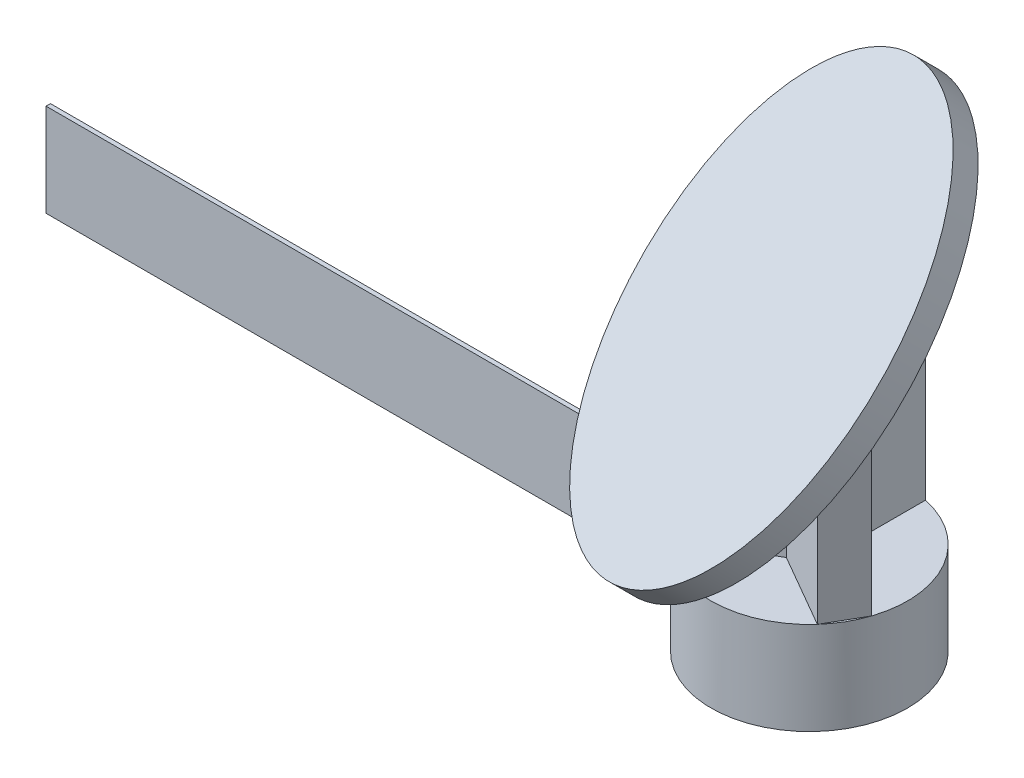
ISO-10303-21;
HEADER;
FILE_DESCRIPTION(('STEP AP214'),'2;1');
FILE_NAME('part.step','',(''),(''),'','','');
FILE_SCHEMA(('AUTOMOTIVE_DESIGN { 1 0 10303 214 1 1 1 1 }'));
ENDSEC;
DATA;
#1=APPLICATION_CONTEXT('core data for automotive mechanical design processes');
#2=APPLICATION_PROTOCOL_DEFINITION('international standard','automotive_design',2000,#1);
#3=PRODUCT_CONTEXT('',#1,'mechanical');
#4=PRODUCT('Part','Part','',(#3));
#5=PRODUCT_RELATED_PRODUCT_CATEGORY('part','',(#4));
#6=PRODUCT_DEFINITION_FORMATION('','',#4);
#7=PRODUCT_DEFINITION_CONTEXT('part definition',#1,'design');
#8=PRODUCT_DEFINITION('design','',#6,#7);
#9=PRODUCT_DEFINITION_SHAPE('','',#8);
#10=(LENGTH_UNIT() NAMED_UNIT(*) SI_UNIT(.MILLI.,.METRE.));
#11=(NAMED_UNIT(*) PLANE_ANGLE_UNIT() SI_UNIT($,.RADIAN.));
#12=(NAMED_UNIT(*) SI_UNIT($,.STERADIAN.) SOLID_ANGLE_UNIT());
#13=UNCERTAINTY_MEASURE_WITH_UNIT(LENGTH_MEASURE(1.E-05),#10,'distance_accuracy_value','');
#14=(GEOMETRIC_REPRESENTATION_CONTEXT(3) GLOBAL_UNCERTAINTY_ASSIGNED_CONTEXT((#13)) GLOBAL_UNIT_ASSIGNED_CONTEXT((#10,
#11,#12)) REPRESENTATION_CONTEXT('',''));
#15=CARTESIAN_POINT('',(0.,0.,0.));
#16=DIRECTION('',(0.,0.,1.));
#17=DIRECTION('',(1.,0.,0.));
#18=AXIS2_PLACEMENT_3D('',#15,#16,#17);
#19=CARTESIAN_POINT('',(0.,21.,0.));
#20=DIRECTION('',(0.,-1.,0.));
#21=DIRECTION('',(0.,0.,-1.));
#22=AXIS2_PLACEMENT_3D('',#19,#20,#21);
#23=CYLINDRICAL_SURFACE('',#22,22.225);
#24=CARTESIAN_POINT('',(-22.225,0.,0.5));
#25=DIRECTION('',(0.,1.,0.));
#26=VECTOR('',#25,1.);
#27=LINE('',#24,#26);
#28=CARTESIAN_POINT('',(-22.2221565787341,0.,0.499968121450206));
#29=VERTEX_POINT('',#28);
#30=CARTESIAN_POINT('',(-22.2221564125486,21.,0.499968805694616));
#31=VERTEX_POINT('',#30);
#32=EDGE_CURVE('E105',#29,#31,#27,.T.);
#33=ORIENTED_EDGE('',*,*,#32,.F.);
#34=CARTESIAN_POINT('',(0.,0.,0.));
#35=DIRECTION('',(0.,-1.,0.));
#36=DIRECTION('',(0.,0.,-1.));
#37=AXIS2_PLACEMENT_3D('',#34,#35,#36);
#38=CIRCLE('',#37,22.225);
#39=CARTESIAN_POINT('',(-22.222156577973,0.,-0.499968166586654));
#40=VERTEX_POINT('',#39);
#41=EDGE_CURVE('E106',#29,#40,#38,.F.);
#42=ORIENTED_EDGE('',*,*,#41,.T.);
#43=CARTESIAN_POINT('',(-22.225,21.,-0.5));
#44=DIRECTION('',(0.,-1.,0.));
#45=VECTOR('',#44,1.);
#46=LINE('',#43,#45);
#47=CARTESIAN_POINT('',(-22.222156395549,21.,-0.499968767093905));
#48=VERTEX_POINT('',#47);
#49=EDGE_CURVE('E115',#48,#40,#46,.T.);
#50=ORIENTED_EDGE('',*,*,#49,.F.);
#51=CARTESIAN_POINT('',(0.,21.,0.));
#52=DIRECTION('',(0.,-1.,0.));
#53=DIRECTION('',(0.,0.,-1.));
#54=AXIS2_PLACEMENT_3D('',#51,#52,#53);
#55=CIRCLE('',#54,22.225);
#56=CARTESIAN_POINT('',(-4.50000000000001,21.,-21.7646645965427));
#57=VERTEX_POINT('',#56);
#58=EDGE_CURVE('E267',#57,#48,#55,.F.);
#59=ORIENTED_EDGE('',*,*,#58,.F.);
#60=CARTESIAN_POINT('',(0.,21.,0.));
#61=DIRECTION('',(0.,1.,0.));
#62=DIRECTION('',(0.,0.,1.));
#63=AXIS2_PLACEMENT_3D('',#60,#61,#62);
#64=CIRCLE('',#63,22.225);
#65=CARTESIAN_POINT('',(4.5,21.,-21.7646645965427));
#66=VERTEX_POINT('',#65);
#67=EDGE_CURVE('E280',#66,#57,#64,.T.);
#68=ORIENTED_EDGE('',*,*,#67,.F.);
#69=CARTESIAN_POINT('',(21.0987524454537,21.,6.98521798124149));
#70=VERTEX_POINT('',#69);
#71=EDGE_CURVE('E51',#70,#66,#64,.T.);
#72=ORIENTED_EDGE('',*,*,#71,.F.);
#73=CARTESIAN_POINT('',(16.5987524454537,21.,14.7794466153014));
#74=VERTEX_POINT('',#73);
#75=EDGE_CURVE('E11',#74,#70,#64,.T.);
#76=ORIENTED_EDGE('',*,*,#75,.F.);
#77=CARTESIAN_POINT('',(-16.5987524454539,21.,14.7794466153012));
#78=VERTEX_POINT('',#77);
#79=EDGE_CURVE('E125',#78,#74,#64,.T.);
#80=ORIENTED_EDGE('',*,*,#79,.F.);
#81=CARTESIAN_POINT('',(-21.0987524454538,21.,6.98521798124118));
#82=VERTEX_POINT('',#81);
#83=EDGE_CURVE('E52',#82,#78,#64,.T.);
#84=ORIENTED_EDGE('',*,*,#83,.F.);
#85=CARTESIAN_POINT('',(0.,21.,0.));
#86=DIRECTION('',(0.,-1.,0.));
#87=DIRECTION('',(0.,0.,-1.));
#88=AXIS2_PLACEMENT_3D('',#85,#86,#87);
#89=CIRCLE('',#88,22.225);
#90=EDGE_CURVE('E61',#31,#82,#89,.F.);
#91=ORIENTED_EDGE('',*,*,#90,.F.);
#92=EDGE_LOOP('',(#33,#42,#50,#59,#68,#72,#76,#80,#84,#91));
#93=FACE_BOUND('',#92,.T.);
#94=ADVANCED_FACE('F41',(#93),#23,.T.);
#95=CARTESIAN_POINT('',(2.24999999999996,92.,3.89711431702999));
#96=DIRECTION('',(-0.499999999999992,0.,-0.866025403784443));
#97=DIRECTION('',(-0.866025403784443,0.,0.499999999999992));
#98=AXIS2_PLACEMENT_3D('',#95,#96,#97);
#99=PLANE('',#98);
#100=DIRECTION('',(0.774596669241491,0.447213595499951,-0.447213595499952));
#101=VECTOR('',#100,1.);
#102=CARTESIAN_POINT('',(11.1395009781814,71.4705768691418,-1.23524146568438));
#103=LINE('',#102,#101);
#104=CARTESIAN_POINT('',(-16.5987524454539,55.4558887881563,14.7794466153012));
#105=VERTEX_POINT('',#104);
#106=CARTESIAN_POINT('',(0.,65.0391829807508,5.19615242270662));
#107=VERTEX_POINT('',#106);
#108=EDGE_CURVE('E193',#105,#107,#103,.T.);
#109=ORIENTED_EDGE('',*,*,#108,.F.);
#110=DIRECTION('',(0.,-1.,0.));
#111=VECTOR('',#110,1.);
#112=CARTESIAN_POINT('',(-16.5987524454539,92.,14.7794466153012));
#113=LINE('',#112,#111);
#114=EDGE_CURVE('E213',#105,#78,#113,.T.);
#115=ORIENTED_EDGE('',*,*,#114,.T.);
#116=DIRECTION('',(0.866025403784443,0.,-0.499999999999992));
#117=VECTOR('',#116,1.);
#118=CARTESIAN_POINT('',(2.24999999999996,21.,3.89711431702999));
#119=LINE('',#118,#117);
#120=CARTESIAN_POINT('',(0.,21.,5.19615242270662));
#121=VERTEX_POINT('',#120);
#122=EDGE_CURVE('E207',#78,#121,#119,.T.);
#123=ORIENTED_EDGE('',*,*,#122,.T.);
#124=DIRECTION('',(0.,-1.,0.));
#125=VECTOR('',#124,1.);
#126=CARTESIAN_POINT('',(0.,92.,5.19615242270662));
#127=LINE('',#126,#125);
#128=EDGE_CURVE('E243',#107,#121,#127,.T.);
#129=ORIENTED_EDGE('',*,*,#128,.F.);
#130=EDGE_LOOP('',(#109,#115,#123,#129));
#131=FACE_BOUND('',#130,.T.);
#132=ADVANCED_FACE('F370',(#131),#99,.F.);
#133=CARTESIAN_POINT('',(-2.25000000000002,92.,3.89711431702996));
#134=DIRECTION('',(0.500000000000004,0.,-0.866025403784436));
#135=DIRECTION('',(-0.866025403784436,0.,-0.500000000000004));
#136=AXIS2_PLACEMENT_3D('',#133,#134,#135);
#137=PLANE('',#136);
#138=DIRECTION('',(0.774596669241481,-0.44721359549996,0.447213595499961));
#139=VECTOR('',#138,1.);
#140=CARTESIAN_POINT('',(-11.1395009781815,71.470576869142,-1.2352414656846));
#141=LINE('',#140,#139);
#142=CARTESIAN_POINT('',(16.5987524454537,55.455888788156,14.7794466153014));
#143=VERTEX_POINT('',#142);
#144=EDGE_CURVE('E197',#107,#143,#141,.T.);
#145=ORIENTED_EDGE('',*,*,#144,.F.);
#146=ORIENTED_EDGE('',*,*,#128,.T.);
#147=DIRECTION('',(0.866025403784436,0.,0.500000000000004));
#148=VECTOR('',#147,1.);
#149=CARTESIAN_POINT('',(-2.25000000000002,21.,3.89711431702996));
#150=LINE('',#149,#148);
#151=EDGE_CURVE('E220',#121,#74,#150,.T.);
#152=ORIENTED_EDGE('',*,*,#151,.T.);
#153=DIRECTION('',(0.,-1.,0.));
#154=VECTOR('',#153,1.);
#155=CARTESIAN_POINT('',(16.5987524454537,92.,14.7794466153014));
#156=LINE('',#155,#154);
#157=EDGE_CURVE('E241',#143,#74,#156,.T.);
#158=ORIENTED_EDGE('',*,*,#157,.F.);
#159=EDGE_LOOP('',(#145,#146,#152,#158));
#160=FACE_BOUND('',#159,.T.);
#161=ADVANCED_FACE('F358',(#160),#137,.F.);
#162=CARTESIAN_POINT('',(18.8487524454537,92.,10.8823322982714));
#163=DIRECTION('',(-0.866025403784436,0.,-0.500000000000004));
#164=DIRECTION('',(-0.500000000000004,0.,0.866025403784436));
#165=AXIS2_PLACEMENT_3D('',#162,#163,#164);
#166=PLANE('',#165);
#167=DIRECTION('',(0.377964473009231,0.654653670707975,-0.654653670707977));
#168=VECTOR('',#167,1.);
#169=CARTESIAN_POINT('',(26.9267892077911,73.3445732029633,-3.10923779950594));
#170=LINE('',#169,#168);
#171=CARTESIAN_POINT('',(21.0987524454538,63.250117422216,6.98521798124148));
#172=VERTEX_POINT('',#171);
#173=EDGE_CURVE('E199',#143,#172,#170,.T.);
#174=ORIENTED_EDGE('',*,*,#173,.F.);
#175=ORIENTED_EDGE('',*,*,#157,.T.);
#176=DIRECTION('',(0.500000000000004,0.,-0.866025403784436));
#177=VECTOR('',#176,1.);
#178=CARTESIAN_POINT('',(18.8487524454537,21.,10.8823322982714));
#179=LINE('',#178,#177);
#180=EDGE_CURVE('E219',#74,#70,#179,.T.);
#181=ORIENTED_EDGE('',*,*,#180,.T.);
#182=DIRECTION('',(0.,-1.,0.));
#183=VECTOR('',#182,1.);
#184=CARTESIAN_POINT('',(21.0987524454537,92.,6.98521798124148));
#185=LINE('',#184,#183);
#186=EDGE_CURVE('E239',#172,#70,#185,.T.);
#187=ORIENTED_EDGE('',*,*,#186,.F.);
#188=EDGE_LOOP('',(#174,#175,#181,#187));
#189=FACE_BOUND('',#188,.T.);
#190=ADVANCED_FACE('F357',(#189),#166,.F.);
#191=CARTESIAN_POINT('',(2.25000000000002,92.,-3.89711431702997));
#192=DIRECTION('',(-0.500000000000004,0.,0.866025403784436));
#193=DIRECTION('',(0.866025403784436,0.,0.500000000000004));
#194=AXIS2_PLACEMENT_3D('',#191,#192,#193);
#195=PLANE('',#194);
#196=DIRECTION('',(-0.774596669241481,0.44721359549996,-0.447213595499961));
#197=VECTOR('',#196,1.);
#198=CARTESIAN_POINT('',(-3.93950097818146,77.7059597763899,-7.47062437293253));
#199=LINE('',#198,#197);
#200=CARTESIAN_POINT('',(4.5,72.8334116148107,-2.59807621135331));
#201=VERTEX_POINT('',#200);
#202=EDGE_CURVE('E201',#172,#201,#199,.T.);
#203=ORIENTED_EDGE('',*,*,#202,.F.);
#204=ORIENTED_EDGE('',*,*,#186,.T.);
#205=DIRECTION('',(-0.866025403784436,0.,-0.500000000000004));
#206=VECTOR('',#205,1.);
#207=CARTESIAN_POINT('',(2.25000000000002,21.,-3.89711431702997));
#208=LINE('',#207,#206);
#209=CARTESIAN_POINT('',(4.5,21.,-2.5980762113533));
#210=VERTEX_POINT('',#209);
#211=EDGE_CURVE('E224',#70,#210,#208,.T.);
#212=ORIENTED_EDGE('',*,*,#211,.T.);
#213=DIRECTION('',(0.,-1.,0.));
#214=VECTOR('',#213,1.);
#215=CARTESIAN_POINT('',(4.5,92.,-2.5980762113533));
#216=LINE('',#215,#214);
#217=EDGE_CURVE('E240',#201,#210,#216,.T.);
#218=ORIENTED_EDGE('',*,*,#217,.F.);
#219=EDGE_LOOP('',(#203,#204,#212,#218));
#220=FACE_BOUND('',#219,.T.);
#221=ADVANCED_FACE('F348',(#220),#195,.F.);
#222=CARTESIAN_POINT('',(4.5,92.,0.));
#223=DIRECTION('',(-1.,0.,0.));
#224=DIRECTION('',(0.,0.,1.));
#225=AXIS2_PLACEMENT_3D('',#222,#223,#224);
#226=PLANE('',#225);
#227=DIRECTION('',(0.,0.707106781186546,-0.707106781186549));
#228=VECTOR('',#227,1.);
#229=CARTESIAN_POINT('',(4.5,81.1176677017287,-10.8823322982713));
#230=LINE('',#229,#228);
#231=CARTESIAN_POINT('',(4.5,92.,-21.7646645965427));
#232=VERTEX_POINT('',#231);
#233=EDGE_CURVE('E206',#201,#232,#230,.T.);
#234=ORIENTED_EDGE('',*,*,#233,.F.);
#235=ORIENTED_EDGE('',*,*,#217,.T.);
#236=DIRECTION('',(0.,0.,-1.));
#237=VECTOR('',#236,1.);
#238=CARTESIAN_POINT('',(4.5,21.,0.));
#239=LINE('',#238,#237);
#240=EDGE_CURVE('E226',#210,#66,#239,.T.);
#241=ORIENTED_EDGE('',*,*,#240,.T.);
#242=DIRECTION('',(0.,-1.,0.));
#243=VECTOR('',#242,1.);
#244=CARTESIAN_POINT('',(4.5,92.,-21.7646645965427));
#245=LINE('',#244,#243);
#246=EDGE_CURVE('E233',#232,#66,#245,.T.);
#247=ORIENTED_EDGE('',*,*,#246,.F.);
#248=EDGE_LOOP('',(#234,#235,#241,#247));
#249=FACE_BOUND('',#248,.T.);
#250=ADVANCED_FACE('F353',(#249),#226,.F.);
#251=CARTESIAN_POINT('',(-4.5,92.,0.));
#252=DIRECTION('',(1.,0.,0.));
#253=DIRECTION('',(0.,0.,-1.));
#254=AXIS2_PLACEMENT_3D('',#251,#252,#253);
#255=PLANE('',#254);
#256=DIRECTION('',(0.,-0.707106781186546,0.707106781186549));
#257=VECTOR('',#256,1.);
#258=CARTESIAN_POINT('',(-4.5,81.1176677017287,-10.8823322982713));
#259=LINE('',#258,#257);
#260=CARTESIAN_POINT('',(-4.5,92.,-21.7646645965427));
#261=VERTEX_POINT('',#260);
#262=CARTESIAN_POINT('',(-4.5,72.8334116148107,-2.59807621135334));
#263=VERTEX_POINT('',#262);
#264=EDGE_CURVE('E178',#261,#263,#259,.T.);
#265=ORIENTED_EDGE('',*,*,#264,.F.);
#266=DIRECTION('',(0.,-1.,0.));
#267=VECTOR('',#266,1.);
#268=CARTESIAN_POINT('',(-4.5,92.,-21.7646645965427));
#269=LINE('',#268,#267);
#270=EDGE_CURVE('E234',#261,#57,#269,.T.);
#271=ORIENTED_EDGE('',*,*,#270,.T.);
#272=DIRECTION('',(0.,0.,1.));
#273=VECTOR('',#272,1.);
#274=CARTESIAN_POINT('',(-4.5,21.,0.));
#275=LINE('',#274,#273);
#276=CARTESIAN_POINT('',(-4.5,21.,-2.59807621135334));
#277=VERTEX_POINT('',#276);
#278=EDGE_CURVE('E74',#57,#277,#275,.T.);
#279=ORIENTED_EDGE('',*,*,#278,.T.);
#280=DIRECTION('',(0.,-1.,0.));
#281=VECTOR('',#280,1.);
#282=CARTESIAN_POINT('',(-4.5,92.,-2.59807621135334));
#283=LINE('',#282,#281);
#284=EDGE_CURVE('E231',#263,#277,#283,.T.);
#285=ORIENTED_EDGE('',*,*,#284,.F.);
#286=EDGE_LOOP('',(#265,#271,#279,#285));
#287=FACE_BOUND('',#286,.T.);
#288=ADVANCED_FACE('F312',(#287),#255,.F.);
#289=CARTESIAN_POINT('',(-2.24999999999996,92.,-3.89711431702999));
#290=DIRECTION('',(0.499999999999992,0.,0.866025403784443));
#291=DIRECTION('',(0.866025403784443,0.,-0.499999999999992));
#292=AXIS2_PLACEMENT_3D('',#289,#290,#291);
#293=PLANE('',#292);
#294=DIRECTION('',(-0.774596669241491,-0.447213595499951,0.447213595499952));
#295=VECTOR('',#294,1.);
#296=CARTESIAN_POINT('',(3.93950097818147,77.7059597763898,-7.47062437293242));
#297=LINE('',#296,#295);
#298=CARTESIAN_POINT('',(-21.0987524454539,63.2501174222162,6.98521798124119));
#299=VERTEX_POINT('',#298);
#300=EDGE_CURVE('E187',#263,#299,#297,.T.);
#301=ORIENTED_EDGE('',*,*,#300,.F.);
#302=ORIENTED_EDGE('',*,*,#284,.T.);
#303=DIRECTION('',(-0.866025403784443,0.,0.499999999999992));
#304=VECTOR('',#303,1.);
#305=CARTESIAN_POINT('',(-2.24999999999996,21.,-3.89711431702999));
#306=LINE('',#305,#304);
#307=EDGE_CURVE('E252',#277,#82,#306,.T.);
#308=ORIENTED_EDGE('',*,*,#307,.T.);
#309=DIRECTION('',(0.,-1.,0.));
#310=VECTOR('',#309,1.);
#311=CARTESIAN_POINT('',(-21.0987524454538,92.,6.98521798124119));
#312=LINE('',#311,#310);
#313=EDGE_CURVE('E229',#299,#82,#312,.T.);
#314=ORIENTED_EDGE('',*,*,#313,.F.);
#315=EDGE_LOOP('',(#301,#302,#308,#314));
#316=FACE_BOUND('',#315,.T.);
#317=ADVANCED_FACE('F309',(#316),#293,.F.);
#318=CARTESIAN_POINT('',(-18.8487524454539,92.,10.8823322982712));
#319=DIRECTION('',(0.866025403784443,0.,-0.499999999999992));
#320=DIRECTION('',(-0.499999999999992,0.,-0.866025403784443));
#321=AXIS2_PLACEMENT_3D('',#318,#319,#320);
#322=PLANE('',#321);
#323=DIRECTION('',(0.377964473009221,-0.654653670707978,0.65465367070798));
#324=VECTOR('',#323,1.);
#325=CARTESIAN_POINT('',(-26.926789207791,73.3445732029636,-3.10923779950622));
#326=LINE('',#325,#324);
#327=EDGE_CURVE('E191',#299,#105,#326,.T.);
#328=ORIENTED_EDGE('',*,*,#327,.F.);
#329=ORIENTED_EDGE('',*,*,#313,.T.);
#330=DIRECTION('',(0.499999999999992,0.,0.866025403784443));
#331=VECTOR('',#330,1.);
#332=CARTESIAN_POINT('',(-18.8487524454539,21.,10.8823322982712));
#333=LINE('',#332,#331);
#334=EDGE_CURVE('E212',#82,#78,#333,.T.);
#335=ORIENTED_EDGE('',*,*,#334,.T.);
#336=ORIENTED_EDGE('',*,*,#114,.F.);
#337=EDGE_LOOP('',(#328,#329,#335,#336));
#338=FACE_BOUND('',#337,.T.);
#339=ADVANCED_FACE('F172',(#338),#322,.F.);
#340=CARTESIAN_POINT('',(0.,21.,0.));
#341=DIRECTION('',(0.,1.,0.));
#342=DIRECTION('',(0.,0.,1.));
#343=AXIS2_PLACEMENT_3D('',#340,#341,#342);
#344=PLANE('',#343);
#345=ORIENTED_EDGE('',*,*,#122,.F.);
#346=ORIENTED_EDGE('',*,*,#79,.T.);
#347=ORIENTED_EDGE('',*,*,#151,.F.);
#348=EDGE_LOOP('',(#345,#346,#347));
#349=FACE_BOUND('',#348,.T.);
#350=ADVANCED_FACE('F365',(#349),#344,.T.);
#351=ORIENTED_EDGE('',*,*,#334,.F.);
#352=ORIENTED_EDGE('',*,*,#83,.T.);
#353=EDGE_LOOP('',(#351,#352));
#354=FACE_BOUND('',#353,.T.);
#355=ADVANCED_FACE('F308',(#354),#344,.T.);
#356=ORIENTED_EDGE('',*,*,#307,.F.);
#357=ORIENTED_EDGE('',*,*,#278,.F.);
#358=ORIENTED_EDGE('',*,*,#58,.T.);
#359=DIRECTION('',(1.,0.,0.));
#360=VECTOR('',#359,1.);
#361=CARTESIAN_POINT('',(-172.225,21.,-0.5));
#362=LINE('',#361,#360);
#363=CARTESIAN_POINT('',(-172.225,21.,-0.5));
#364=VERTEX_POINT('',#363);
#365=EDGE_CURVE('E135',#364,#48,#362,.T.);
#366=ORIENTED_EDGE('',*,*,#365,.F.);
#367=DIRECTION('',(0.,0.,-1.));
#368=VECTOR('',#367,1.);
#369=CARTESIAN_POINT('',(-172.225,21.,-0.5));
#370=LINE('',#369,#368);
#371=CARTESIAN_POINT('',(-172.225,21.,0.5));
#372=VERTEX_POINT('',#371);
#373=EDGE_CURVE('E289',#372,#364,#370,.T.);
#374=ORIENTED_EDGE('',*,*,#373,.F.);
#375=DIRECTION('',(1.,0.,0.));
#376=VECTOR('',#375,1.);
#377=CARTESIAN_POINT('',(-172.225,21.,0.5));
#378=LINE('',#377,#376);
#379=EDGE_CURVE('E183',#372,#31,#378,.T.);
#380=ORIENTED_EDGE('',*,*,#379,.T.);
#381=ORIENTED_EDGE('',*,*,#90,.T.);
#382=EDGE_LOOP('',(#356,#357,#358,#366,#374,#380,#381));
#383=FACE_BOUND('',#382,.T.);
#384=ADVANCED_FACE('F272',(#383),#344,.T.);
#385=DIRECTION('',(-1.,0.,0.));
#386=VECTOR('',#385,1.);
#387=CARTESIAN_POINT('',(0.,21.,-21.7646645965427));
#388=LINE('',#387,#386);
#389=EDGE_CURVE('E84',#66,#57,#388,.T.);
#390=ORIENTED_EDGE('',*,*,#389,.F.);
#391=ORIENTED_EDGE('',*,*,#67,.T.);
#392=EDGE_LOOP('',(#390,#391));
#393=FACE_BOUND('',#392,.T.);
#394=ADVANCED_FACE('F405',(#393),#344,.T.);
#395=ORIENTED_EDGE('',*,*,#240,.F.);
#396=ORIENTED_EDGE('',*,*,#211,.F.);
#397=ORIENTED_EDGE('',*,*,#71,.T.);
#398=EDGE_LOOP('',(#395,#396,#397));
#399=FACE_BOUND('',#398,.T.);
#400=ADVANCED_FACE('F390',(#399),#344,.T.);
#401=ORIENTED_EDGE('',*,*,#180,.F.);
#402=ORIENTED_EDGE('',*,*,#75,.T.);
#403=EDGE_LOOP('',(#401,#402));
#404=FACE_BOUND('',#403,.T.);
#405=ADVANCED_FACE('F387',(#404),#344,.T.);
#406=CARTESIAN_POINT('',(0.,0.,0.));
#407=DIRECTION('',(0.,1.,0.));
#408=DIRECTION('',(0.,0.,1.));
#409=AXIS2_PLACEMENT_3D('',#406,#407,#408);
#410=PLANE('',#409);
#411=CARTESIAN_POINT('',(0.,0.,0.));
#412=DIRECTION('',(0.,-1.,0.));
#413=DIRECTION('',(0.,0.,-1.));
#414=AXIS2_PLACEMENT_3D('',#411,#412,#413);
#415=CIRCLE('',#414,10.);
#416=CARTESIAN_POINT('',(0.,0.,-10.));
#417=VERTEX_POINT('',#416);
#418=EDGE_CURVE('E246',#417,#417,#415,.T.);
#419=ORIENTED_EDGE('',*,*,#418,.F.);
#420=EDGE_LOOP('',(#419));
#421=FACE_BOUND('',#420,.T.);
#422=ORIENTED_EDGE('',*,*,#41,.F.);
#423=DIRECTION('',(1.,0.,0.));
#424=VECTOR('',#423,1.);
#425=CARTESIAN_POINT('',(-172.225,0.,0.5));
#426=LINE('',#425,#424);
#427=CARTESIAN_POINT('',(-172.225,0.,0.5));
#428=VERTEX_POINT('',#427);
#429=EDGE_CURVE('E121',#428,#29,#426,.T.);
#430=ORIENTED_EDGE('',*,*,#429,.F.);
#431=DIRECTION('',(0.,0.,1.));
#432=VECTOR('',#431,1.);
#433=CARTESIAN_POINT('',(-172.225,0.,-0.5));
#434=LINE('',#433,#432);
#435=CARTESIAN_POINT('',(-172.225,0.,-0.5));
#436=VERTEX_POINT('',#435);
#437=EDGE_CURVE('E128',#436,#428,#434,.T.);
#438=ORIENTED_EDGE('',*,*,#437,.F.);
#439=DIRECTION('',(1.,0.,0.));
#440=VECTOR('',#439,1.);
#441=CARTESIAN_POINT('',(-172.225,0.,-0.5));
#442=LINE('',#441,#440);
#443=EDGE_CURVE('E123',#436,#40,#442,.T.);
#444=ORIENTED_EDGE('',*,*,#443,.T.);
#445=EDGE_LOOP('',(#422,#430,#438,#444));
#446=FACE_BOUND('',#445,.T.);
#447=ADVANCED_FACE('F117',(#421,#446),#410,.F.);
#448=CARTESIAN_POINT('',(0.,7.,0.));
#449=DIRECTION('',(0.,-1.,0.));
#450=DIRECTION('',(0.,0.,-1.));
#451=AXIS2_PLACEMENT_3D('',#448,#449,#450);
#452=CYLINDRICAL_SURFACE('',#451,10.);
#453=CARTESIAN_POINT('',(0.,7.,0.));
#454=DIRECTION('',(0.,-1.,0.));
#455=DIRECTION('',(0.,0.,-1.));
#456=AXIS2_PLACEMENT_3D('',#453,#454,#455);
#457=CIRCLE('',#456,10.);
#458=CARTESIAN_POINT('',(0.,7.,-10.));
#459=VERTEX_POINT('',#458);
#460=EDGE_CURVE('E127',#459,#459,#457,.T.);
#461=ORIENTED_EDGE('',*,*,#460,.F.);
#462=EDGE_LOOP('',(#461));
#463=FACE_BOUND('',#462,.T.);
#464=ORIENTED_EDGE('',*,*,#418,.T.);
#465=EDGE_LOOP('',(#464));
#466=FACE_BOUND('',#465,.T.);
#467=ADVANCED_FACE('F381',(#463,#466),#452,.F.);
#468=CARTESIAN_POINT('',(0.,7.,0.));
#469=DIRECTION('',(0.,-1.,0.));
#470=DIRECTION('',(0.,0.,-1.));
#471=AXIS2_PLACEMENT_3D('',#468,#469,#470);
#472=PLANE('',#471);
#473=ORIENTED_EDGE('',*,*,#460,.T.);
#474=EDGE_LOOP('',(#473));
#475=FACE_BOUND('',#474,.T.);
#476=ADVANCED_FACE('F378',(#475),#472,.T.);
#477=CARTESIAN_POINT('',(0.,92.,-21.7646645965427));
#478=DIRECTION('',(0.,0.,1.));
#479=DIRECTION('',(1.,0.,0.));
#480=AXIS2_PLACEMENT_3D('',#477,#478,#479);
#481=PLANE('',#480);
#482=ORIENTED_EDGE('',*,*,#389,.T.);
#483=ORIENTED_EDGE('',*,*,#270,.F.);
#484=DIRECTION('',(-1.,0.,0.));
#485=VECTOR('',#484,1.);
#486=CARTESIAN_POINT('',(0.,92.,-21.7646645965427));
#487=LINE('',#486,#485);
#488=EDGE_CURVE('E209',#232,#261,#487,.T.);
#489=ORIENTED_EDGE('',*,*,#488,.F.);
#490=ORIENTED_EDGE('',*,*,#246,.T.);
#491=EDGE_LOOP('',(#482,#483,#489,#490));
#492=FACE_BOUND('',#491,.T.);
#493=ADVANCED_FACE('F170',(#492),#481,.F.);
#494=CARTESIAN_POINT('',(0.,65.0391829807508,5.19615242270662));
#495=DIRECTION('',(0.,0.707106781186549,0.707106781186546));
#496=DIRECTION('',(0.,-0.707106781186546,0.707106781186549));
#497=AXIS2_PLACEMENT_3D('',#494,#495,#496);
#498=PLANE('',#497);
#499=CARTESIAN_POINT('',(0.,65.0391829807508,5.19615242270662));
#500=DIRECTION('',(0.,0.707106781186549,0.707106781186546));
#501=DIRECTION('',(0.,0.707106781186546,-0.707106781186549));
#502=AXIS2_PLACEMENT_3D('',#499,#500,#501);
#503=ELLIPSE('',#502,48.6832726429592,26.4082974539149);
#504=CARTESIAN_POINT('',(0.,99.4634551969407,-29.2281197934834));
#505=VERTEX_POINT('',#504);
#506=EDGE_CURVE('E180',#505,#505,#503,.T.);
#507=ORIENTED_EDGE('',*,*,#506,.F.);
#508=EDGE_LOOP('',(#507));
#509=FACE_BOUND('',#508,.T.);
#510=ORIENTED_EDGE('',*,*,#202,.T.);
#511=ORIENTED_EDGE('',*,*,#233,.T.);
#512=ORIENTED_EDGE('',*,*,#488,.T.);
#513=ORIENTED_EDGE('',*,*,#264,.T.);
#514=ORIENTED_EDGE('',*,*,#300,.T.);
#515=ORIENTED_EDGE('',*,*,#327,.T.);
#516=ORIENTED_EDGE('',*,*,#108,.T.);
#517=ORIENTED_EDGE('',*,*,#144,.T.);
#518=ORIENTED_EDGE('',*,*,#173,.T.);
#519=EDGE_LOOP('',(#510,#511,#512,#513,#514,#515,#516,#517,#518));
#520=FACE_BOUND('',#519,.T.);
#521=ADVANCED_FACE('F163',(#509,#520),#498,.F.);
#522=CARTESIAN_POINT('',(0.,70.6960372302432,10.853006672199));
#523=DIRECTION('',(0.,0.707106781186549,0.707106781186546));
#524=DIRECTION('',(0.,0.707106781186546,-0.707106781186549));
#525=AXIS2_PLACEMENT_3D('',#522,#523,#524);
#526=ELLIPSE('',#525,48.6832726429592,26.4082974539149);
#527=DIRECTION('',(0.,-0.707106781186549,-0.707106781186546));
#528=VECTOR('',#527,1.);
#529=SURFACE_OF_LINEAR_EXTRUSION('',#526,#528);
#530=CARTESIAN_POINT('',(0.,105.120309446433,-23.5712655439911));
#531=VERTEX_POINT('',#530);
#532=EDGE_CURVE('E174',#531,#531,#526,.T.);
#533=ORIENTED_EDGE('',*,*,#532,.F.);
#534=EDGE_LOOP('',(#533));
#535=FACE_BOUND('',#534,.T.);
#536=ORIENTED_EDGE('',*,*,#506,.T.);
#537=EDGE_LOOP('',(#536));
#538=FACE_BOUND('',#537,.T.);
#539=ADVANCED_FACE('F165',(#535,#538),#529,.F.);
#540=CARTESIAN_POINT('',(0.,70.6960372302432,10.853006672199));
#541=DIRECTION('',(0.,0.707106781186549,0.707106781186546));
#542=DIRECTION('',(0.,-0.707106781186546,0.707106781186549));
#543=AXIS2_PLACEMENT_3D('',#540,#541,#542);
#544=PLANE('',#543);
#545=ORIENTED_EDGE('',*,*,#532,.T.);
#546=EDGE_LOOP('',(#545));
#547=FACE_BOUND('',#546,.T.);
#548=ADVANCED_FACE('F160',(#547),#544,.T.);
#549=CARTESIAN_POINT('',(-172.225,0.,0.5));
#550=DIRECTION('',(0.,0.,-1.));
#551=DIRECTION('',(-1.,0.,0.));
#552=AXIS2_PLACEMENT_3D('',#549,#550,#551);
#553=PLANE('',#552);
#554=ORIENTED_EDGE('',*,*,#32,.T.);
#555=ORIENTED_EDGE('',*,*,#379,.F.);
#556=DIRECTION('',(0.,1.,0.));
#557=VECTOR('',#556,1.);
#558=CARTESIAN_POINT('',(-172.225,0.,0.5));
#559=LINE('',#558,#557);
#560=EDGE_CURVE('E129',#428,#372,#559,.T.);
#561=ORIENTED_EDGE('',*,*,#560,.F.);
#562=ORIENTED_EDGE('',*,*,#429,.T.);
#563=EDGE_LOOP('',(#554,#555,#561,#562));
#564=FACE_BOUND('',#563,.T.);
#565=ADVANCED_FACE('F130',(#564),#553,.F.);
#566=CARTESIAN_POINT('',(-172.225,0.,-0.5));
#567=DIRECTION('',(0.,0.,1.));
#568=DIRECTION('',(1.,0.,0.));
#569=AXIS2_PLACEMENT_3D('',#566,#567,#568);
#570=PLANE('',#569);
#571=ORIENTED_EDGE('',*,*,#49,.T.);
#572=ORIENTED_EDGE('',*,*,#443,.F.);
#573=DIRECTION('',(0.,-1.,0.));
#574=VECTOR('',#573,1.);
#575=CARTESIAN_POINT('',(-172.225,0.,-0.5));
#576=LINE('',#575,#574);
#577=EDGE_CURVE('E134',#364,#436,#576,.T.);
#578=ORIENTED_EDGE('',*,*,#577,.F.);
#579=ORIENTED_EDGE('',*,*,#365,.T.);
#580=EDGE_LOOP('',(#571,#572,#578,#579));
#581=FACE_BOUND('',#580,.T.);
#582=ADVANCED_FACE('F156',(#581),#570,.F.);
#583=CARTESIAN_POINT('',(-172.225,0.,0.));
#584=DIRECTION('',(1.,0.,0.));
#585=DIRECTION('',(0.,0.,-1.));
#586=AXIS2_PLACEMENT_3D('',#583,#584,#585);
#587=PLANE('',#586);
#588=ORIENTED_EDGE('',*,*,#560,.T.);
#589=ORIENTED_EDGE('',*,*,#373,.T.);
#590=ORIENTED_EDGE('',*,*,#577,.T.);
#591=ORIENTED_EDGE('',*,*,#437,.T.);
#592=EDGE_LOOP('',(#588,#589,#590,#591));
#593=FACE_BOUND('',#592,.T.);
#594=ADVANCED_FACE('F291',(#593),#587,.F.);
#595=CLOSED_SHELL('',(#94,#132,#161,#190,#221,#250,#288,#317,#339,#350,#355,#384,#394,#400,#405,
#447,#467,#476,#493,#521,#539,#548,#565,#582,#594));
#596=MANIFOLD_SOLID_BREP('B2',#595);
#597=ADVANCED_BREP_SHAPE_REPRESENTATION('',(#18,#596),#14);
#598=SHAPE_DEFINITION_REPRESENTATION(#9,#597);
ENDSEC;
END-ISO-10303-21;
